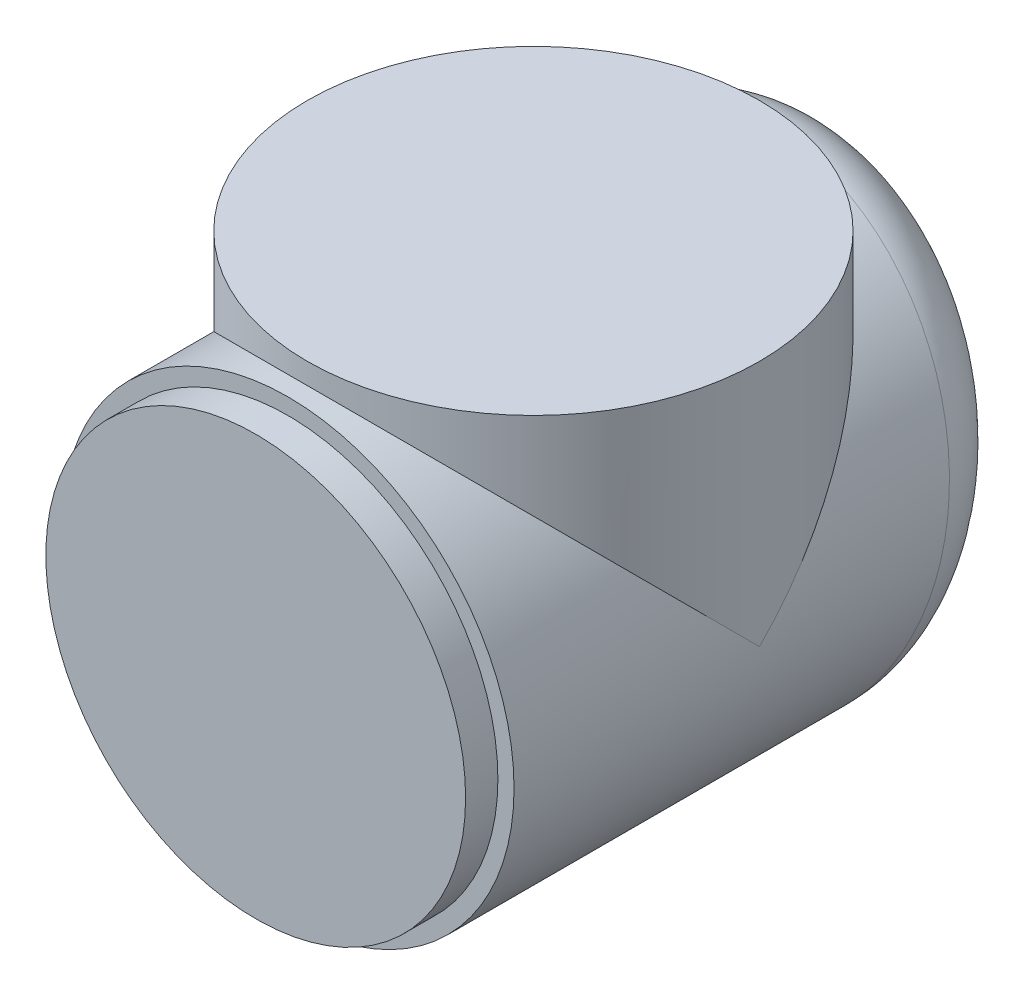
ISO-10303-21;
HEADER;
FILE_DESCRIPTION(('STEP AP214'),'2;1');
FILE_NAME('part.step','',(''),(''),'','','');
FILE_SCHEMA(('AUTOMOTIVE_DESIGN { 1 0 10303 214 1 1 1 1 }'));
ENDSEC;
DATA;
#1=APPLICATION_CONTEXT('core data for automotive mechanical design processes');
#2=APPLICATION_PROTOCOL_DEFINITION('international standard','automotive_design',2000,#1);
#3=PRODUCT_CONTEXT('',#1,'mechanical');
#4=PRODUCT('Part','Part','',(#3));
#5=PRODUCT_RELATED_PRODUCT_CATEGORY('part','',(#4));
#6=PRODUCT_DEFINITION_FORMATION('','',#4);
#7=PRODUCT_DEFINITION_CONTEXT('part definition',#1,'design');
#8=PRODUCT_DEFINITION('design','',#6,#7);
#9=PRODUCT_DEFINITION_SHAPE('','',#8);
#10=(LENGTH_UNIT() NAMED_UNIT(*) SI_UNIT(.MILLI.,.METRE.));
#11=(NAMED_UNIT(*) PLANE_ANGLE_UNIT() SI_UNIT($,.RADIAN.));
#12=(NAMED_UNIT(*) SI_UNIT($,.STERADIAN.) SOLID_ANGLE_UNIT());
#13=UNCERTAINTY_MEASURE_WITH_UNIT(LENGTH_MEASURE(1.E-05),#10,'distance_accuracy_value','');
#14=(GEOMETRIC_REPRESENTATION_CONTEXT(3) GLOBAL_UNCERTAINTY_ASSIGNED_CONTEXT((#13)) GLOBAL_UNIT_ASSIGNED_CONTEXT((#10,
#11,#12)) REPRESENTATION_CONTEXT('',''));
#15=CARTESIAN_POINT('',(0.,0.,0.));
#16=DIRECTION('',(0.,0.,1.));
#17=DIRECTION('',(1.,0.,0.));
#18=AXIS2_PLACEMENT_3D('',#15,#16,#17);
#19=CARTESIAN_POINT('',(0.,0.,-49.1));
#20=DIRECTION('',(0.,0.,1.));
#21=DIRECTION('',(1.,0.,0.));
#22=AXIS2_PLACEMENT_3D('',#19,#20,#21);
#23=CYLINDRICAL_SURFACE('',#22,35.);
#24=CARTESIAN_POINT('',(0.,0.,0.));
#25=DIRECTION('',(0.,0.707106781186547,0.707106781186547));
#26=DIRECTION('',(0.,-0.707106781186547,0.707106781186547));
#27=AXIS2_PLACEMENT_3D('',#24,#25,#26);
#28=ELLIPSE('',#27,49.4974746830583,35.);
#29=CARTESIAN_POINT('',(-35.,0.,0.));
#30=VERTEX_POINT('',#29);
#31=CARTESIAN_POINT('',(35.,0.,0.));
#32=VERTEX_POINT('',#31);
#33=EDGE_CURVE('E44',#30,#32,#28,.F.);
#34=ORIENTED_EDGE('',*,*,#33,.T.);
#35=CARTESIAN_POINT('',(0.,0.,0.));
#36=DIRECTION('',(0.,-0.707106781186547,0.707106781186547));
#37=DIRECTION('',(0.,0.707106781186547,0.707106781186547));
#38=AXIS2_PLACEMENT_3D('',#35,#36,#37);
#39=ELLIPSE('',#38,49.4974746830583,35.);
#40=EDGE_CURVE('E11',#32,#30,#39,.T.);
#41=ORIENTED_EDGE('',*,*,#40,.T.);
#42=EDGE_LOOP('',(#34,#41));
#43=FACE_BOUND('',#42,.T.);
#44=CARTESIAN_POINT('',(0.,0.,-28.6998430153135));
#45=DIRECTION('',(0.,-0.199960011996001,-0.979804058780407));
#46=DIRECTION('',(0.,-0.979804058780407,0.199960011996001));
#47=AXIS2_PLACEMENT_3D('',#44,#45,#46);
#48=ELLIPSE('',#47,35.7214278572857,35.);
#49=CARTESIAN_POINT('',(0.,-35.,-21.5569858724564));
#50=VERTEX_POINT('',#49);
#51=EDGE_CURVE('E53',#50,#50,#48,.F.);
#52=ORIENTED_EDGE('',*,*,#51,.T.);
#53=EDGE_LOOP('',(#52));
#54=FACE_BOUND('',#53,.T.);
#55=CARTESIAN_POINT('',(0.,0.,38.));
#56=DIRECTION('',(0.,0.,1.));
#57=DIRECTION('',(1.,0.,0.));
#58=AXIS2_PLACEMENT_3D('',#55,#56,#57);
#59=CIRCLE('',#58,35.);
#60=CARTESIAN_POINT('',(35.,0.,38.));
#61=VERTEX_POINT('',#60);
#62=EDGE_CURVE('E62',#61,#61,#59,.T.);
#63=ORIENTED_EDGE('',*,*,#62,.F.);
#64=EDGE_LOOP('',(#63));
#65=FACE_BOUND('',#64,.T.);
#66=ADVANCED_FACE('F34',(#43,#54,#65),#23,.T.);
#67=CARTESIAN_POINT('',(-35.,-35.,-29.1));
#68=DIRECTION('',(0.,0.274721127897378,0.961523947640823));
#69=DIRECTION('',(0.,-0.961523947640823,0.274721127897378));
#70=AXIS2_PLACEMENT_3D('',#67,#68,#69);
#71=PLANE('',#70);
#72=CARTESIAN_POINT('',(0.,-2.74721127897378,-38.3150824917218));
#73=DIRECTION('',(0.,0.274721127897378,0.961523947640823));
#74=DIRECTION('',(0.,-0.961523947640823,0.274721127897378));
#75=AXIS2_PLACEMENT_3D('',#72,#73,#74);
#76=ELLIPSE('',#75,26.0003924617161,25.);
#77=CARTESIAN_POINT('',(0.,-27.7472112789738,-31.1722253488646));
#78=VERTEX_POINT('',#77);
#79=EDGE_CURVE('E68',#78,#78,#76,.F.);
#80=ORIENTED_EDGE('',*,*,#79,.T.);
#81=EDGE_LOOP('',(#80));
#82=FACE_BOUND('',#81,.T.);
#83=ADVANCED_FACE('F56',(#82),#71,.F.);
#84=CARTESIAN_POINT('',(0.,-27.7472112789738,-31.1722253488646));
#85=CARTESIAN_POINT('',(0.,-35.,-29.1));
#86=CARTESIAN_POINT('',(0.,-35.,-21.5569858724564));
#87=CARTESIAN_POINT('',(1.09108091283731,-27.7472112789738,-31.1722253488646));
#88=CARTESIAN_POINT('',(1.43345338118228,-35.,-29.1));
#89=CARTESIAN_POINT('',(1.52751327797223,-35.,-21.5569858724564));
#90=CARTESIAN_POINT('',(2.18216182567463,-27.6756476021358,-31.1926721136755));
#91=CARTESIAN_POINT('',(2.86779095380467,-34.9120710459134,-29.1251225583105));
#92=CARTESIAN_POINT('',(3.05502655594448,-34.8998108524268,-21.5774326372673));
#93=CARTESIAN_POINT('',(4.34563680370093,-27.3908219923918,-31.2740508593166));
#94=CARTESIAN_POINT('',(5.7139282748752,-34.5621837627229,-29.2250903535077));
#95=CARTESIAN_POINT('',(6.08389152518131,-34.5010549987852,-21.6588113829084));
#96=CARTESIAN_POINT('',(5.41800305841691,-27.1773650124044,-31.3350385678845));
#97=CARTESIAN_POINT('',(7.12741061631932,-34.299556418007,-29.3001267377123));
#98=CARTESIAN_POINT('',(7.58520428178367,-34.2022152268028,-21.7197990914762));
#99=CARTESIAN_POINT('',(7.52574038951876,-26.6126009654066,-31.4963997241696));
#100=CARTESIAN_POINT('',(9.91147793625199,-33.6043492969241,-29.498757343736));
#101=CARTESIAN_POINT('',(10.5360365453263,-33.4115455610059,-21.8811602477613));
#102=CARTESIAN_POINT('',(8.5610058112401,-26.260929816784,-31.5968771952046));
#103=CARTESIAN_POINT('',(11.2834976821545,-33.1704847082132,-29.6227186547962));
#104=CARTESIAN_POINT('',(11.9854081357361,-32.9192059529343,-21.9816377187963));
#105=CARTESIAN_POINT('',(10.5769171990641,-25.4259154958068,-31.8354527154838));
#106=CARTESIAN_POINT('',(13.964902297941,-32.13903197755,-29.9174194349857));
#107=CARTESIAN_POINT('',(14.8076840786898,-31.7501859035662,-22.2202132390755));
#108=CARTESIAN_POINT('',(11.5573451107606,-24.9420862445672,-31.9736896444094));
#109=CARTESIAN_POINT('',(15.2753388623893,-31.5396423058252,-30.0886736269071));
#110=CARTESIAN_POINT('',(16.1802831550649,-31.0728249518308,-22.3584501680011));
#111=CARTESIAN_POINT('',(13.4469261071108,-23.8511405237061,-32.2853884217983));
#112=CARTESIAN_POINT('',(17.814644728026,-30.1854079954532,-30.4755977155848));
#113=CARTESIAN_POINT('',(18.8256965499551,-29.5455009426253,-22.67014894539));
#114=CARTESIAN_POINT('',(14.3557361132463,-23.2434753665676,-32.4590070381235));
#115=CARTESIAN_POINT('',(19.0440864861379,-29.4283771564413,-30.6918922410168));
#116=CARTESIAN_POINT('',(20.0980305585448,-28.6947697226314,-22.8437675617153));
#117=CARTESIAN_POINT('',(16.0866579251947,-21.9152973800787,-32.8384864628347));
#118=CARTESIAN_POINT('',(21.4034304353771,-27.769050289356,-31.1659856316126));
#119=CARTESIAN_POINT('',(22.5213210952725,-26.8353205415468,-23.2232469864264));
#120=CARTESIAN_POINT('',(16.9083128440085,-21.1942347508351,-33.0445043569043));
#121=CARTESIAN_POINT('',(22.5333744855595,-26.8643329539469,-31.4244762988723));
#122=CARTESIAN_POINT('',(23.6716379816119,-25.8258328606059,-23.429264880496));
#123=CARTESIAN_POINT('',(18.4509744322198,-19.6515786636179,-33.4852632389663));
#124=CARTESIAN_POINT('',(24.676840963195,-24.9216272074508,-31.9795350835855));
#125=CARTESIAN_POINT('',(25.8313642051077,-23.6661143385018,-23.8700237625581));
#126=CARTESIAN_POINT('',(19.1714429517694,-18.8294882870842,-33.7201462036902));
#127=CARTESIAN_POINT('',(25.6898673934373,-23.8811345784227,-32.2768186918792));
#128=CARTESIAN_POINT('',(26.8400201324772,-22.5151878113546,-24.104906727282));
#129=CARTESIAN_POINT('',(20.4994744403501,-17.0987697610045,-34.2146372111416));
#130=CARTESIAN_POINT('',(27.5838169087081,-21.6805680482021,-32.905551986228));
#131=CARTESIAN_POINT('',(28.6992642164901,-20.092181874843,-24.5993977347333));
#132=CARTESIAN_POINT('',(21.1064660290273,-16.1897367622214,-34.4743609250796));
#133=CARTESIAN_POINT('',(28.463737419209,-20.5180499172611,-33.2377000236397));
#134=CARTESIAN_POINT('',(29.5490524406382,-18.8195356765467,-24.8591214486714));
#135=CARTESIAN_POINT('',(22.1971755752942,-14.3005783973016,-35.0141204579138));
#136=CARTESIAN_POINT('',(30.0770894474211,-18.0887232943095,-33.931793344483));
#137=CARTESIAN_POINT('',(31.0760458054118,-16.174713965659,-25.3988809815056));
#138=CARTESIAN_POINT('',(22.6803447957253,-13.3201604836859,-35.294239861804));
#139=CARTESIAN_POINT('',(30.8090734661703,-16.819656371565,-34.2943838938385));
#140=CARTESIAN_POINT('',(31.7524827140154,-14.802128886597,-25.6790003853958));
#141=CARTESIAN_POINT('',(23.5151020941965,-11.3048841710705,-35.8700330939798));
#142=CARTESIAN_POINT('',(32.1135517283439,-14.1940494438345,-35.0445573017616));
#143=CARTESIAN_POINT('',(32.9211429318751,-11.9807420489355,-26.2547936175716));
#144=CARTESIAN_POINT('',(23.8662198279514,-10.2698458696208,-36.1657583229655));
#145=CARTESIAN_POINT('',(32.684237045671,-12.8355418642744,-35.432702324493));
#146=CARTESIAN_POINT('',(33.4127077591319,-10.5316884269059,-26.5505188465572));
#147=CARTESIAN_POINT('',(24.4307703921956,-8.16292059947017,-36.76773697158));
#148=CARTESIAN_POINT('',(33.6545942821809,-10.0493479846885,-36.2287577186604));
#149=CARTESIAN_POINT('',(34.2030785490738,-7.58199304869495,-27.1524974951717));
#150=CARTESIAN_POINT('',(24.6438597383181,-7.09094864238911,-37.0740146736031));
#151=CARTESIAN_POINT('',(34.0521939881995,-8.62006881925728,-36.6371231944979));
#152=CARTESIAN_POINT('',(34.5014036336453,-6.08123230878147,-27.4587751971949));
#153=CARTESIAN_POINT('',(24.9285650945313,-4.92840289461881,-37.6918848872518));
#154=CARTESIAN_POINT('',(34.6664445268543,-5.71208354457657,-37.467976130121));
#155=CARTESIAN_POINT('',(34.8999911323438,-3.05366826190303,-28.0766454108435));
#156=CARTESIAN_POINT('',(25.,-3.8378070867963,-38.0034836894868));
#157=CARTESIAN_POINT('',(34.8808676930596,-4.23222329855906,-37.8907933432688));
#158=CARTESIAN_POINT('',(35.,-1.52683413095152,-28.3882442130785));
#159=CARTESIAN_POINT('',(25.,-1.65661547115127,-38.6266812939568));
#160=CARTESIAN_POINT('',(35.1205686427329,-1.24429499839684,-38.7444871433152));
#161=CARTESIAN_POINT('',(35.,1.52683413095151,-29.0114418175485));
#162=CARTESIAN_POINT('',(24.9285650945313,-0.56601966332876,-38.9382800961918));
#163=CARTESIAN_POINT('',(35.1435782738045,0.264442596963204,-39.1755550277038));
#164=CARTESIAN_POINT('',(34.8999911323438,3.05366826190303,-29.3230406197835));
#165=CARTESIAN_POINT('',(24.6438597383181,1.59652608444155,-39.5561503098404));
#166=CARTESIAN_POINT('',(34.9942122083426,3.28740784928805,-40.0392593855109));
#167=CARTESIAN_POINT('',(34.5014036336453,6.08123230878146,-29.9409108334322));
#168=CARTESIAN_POINT('',(24.4307703921956,2.66849804152261,-39.8624280118636));
#169=CARTESIAN_POINT('',(34.8196492389227,4.80179209448718,-40.4719405984249));
#170=CARTESIAN_POINT('',(34.2030785490738,7.58199304869495,-30.2471885354554));
#171=CARTESIAN_POINT('',(23.8662198279514,4.77542331167326,-40.4644066604781));
#172=CARTESIAN_POINT('',(34.2711691464028,7.81180347985214,-41.3319438513863));
#173=CARTESIAN_POINT('',(33.4127077591319,10.5316884269059,-30.8491671840698));
#174=CARTESIAN_POINT('',(23.5151020941965,5.81046161312297,-40.7601318894637));
#175=CARTESIAN_POINT('',(33.8952733437755,9.30706477504779,-41.7591613642994));
#176=CARTESIAN_POINT('',(32.9211429318751,11.9807420489355,-31.1448924130555));
#177=CARTESIAN_POINT('',(22.6803447957253,7.82573792573832,-41.3359251216395));
#178=CARTESIAN_POINT('',(32.9428685539385,12.2530635758136,-42.6008753073753));
#179=CARTESIAN_POINT('',(31.7524827140154,14.8021288865969,-31.7206856452313));
#180=CARTESIAN_POINT('',(22.1971755752942,8.80615583935407,-41.6160445255297));
#181=CARTESIAN_POINT('',(32.3647226134196,13.7029259797655,-43.0151217085044));
#182=CARTESIAN_POINT('',(31.0760458054119,16.174713965659,-32.0008050491215));
#183=CARTESIAN_POINT('',(21.1064660290273,10.6953142042738,-42.1558040583639));
#184=CARTESIAN_POINT('',(31.0098445076532,16.5309530954485,-43.8231294558424));
#185=CARTESIAN_POINT('',(29.5490524406382,18.8195356765467,-32.5405645819557));
#186=CARTESIAN_POINT('',(20.4994744403501,11.6043472030569,-42.415527772302));
#187=CARTESIAN_POINT('',(30.2319520886626,17.907775095461,-44.2165071701317));
#188=CARTESIAN_POINT('',(28.6992642164901,20.092181874843,-32.8002882958937));
#189=CARTESIAN_POINT('',(19.1714429517694,13.3350657291366,-42.9100187797533));
#190=CARTESIAN_POINT('',(28.4835923577729,20.5614355524542,-44.9746958721298));
#191=CARTESIAN_POINT('',(26.8400201324772,22.5151878113546,-33.2947793033451));
#192=CARTESIAN_POINT('',(18.4509744322198,14.1571561056704,-43.1449017444772));
#193=CARTESIAN_POINT('',(27.512570472187,21.8365403070051,-45.3390115162872));
#194=CARTESIAN_POINT('',(25.8313642051077,23.6661143385018,-33.529662268069));
#195=CARTESIAN_POINT('',(16.9083128440085,15.6998121928876,-43.5856606265393));
#196=CARTESIAN_POINT('',(25.3887076598691,24.2579343636668,-46.0308383896191));
#197=CARTESIAN_POINT('',(23.6716379816119,25.8258328606059,-33.9704211501311));
#198=CARTESIAN_POINT('',(16.0866579251947,16.4208748221311,-43.7916785206089));
#199=CARTESIAN_POINT('',(24.2360278637739,25.402215398627,-46.3577758281791));
#200=CARTESIAN_POINT('',(22.5213210952725,26.8353205415468,-34.1764390442006));
#201=CARTESIAN_POINT('',(14.3557361132463,17.74905280862,-44.17115794532));
#202=CARTESIAN_POINT('',(21.7650546439561,27.5334915626623,-46.9667118750464));
#203=CARTESIAN_POINT('',(20.0980305585448,28.6947697226314,-34.5559184689118));
#204=CARTESIAN_POINT('',(13.4469261071108,18.3567179657586,-44.3447765616453));
#205=CARTESIAN_POINT('',(20.4477115945124,28.5183601608445,-47.2481029030984));
#206=CARTESIAN_POINT('',(18.8256965499551,29.5455009426253,-34.7295370852371));
#207=CARTESIAN_POINT('',(11.5573451107606,19.4476636866196,-44.6564753390342));
#208=CARTESIAN_POINT('',(17.6695466176983,30.3039719823389,-47.7582777092397));
#209=CARTESIAN_POINT('',(16.1802831550649,31.0728249518308,-35.0412358626259));
#210=CARTESIAN_POINT('',(10.5769171990641,19.9314929378592,-44.7947122679598));
#211=CARTESIAN_POINT('',(16.2104818820974,31.1026588366051,-47.9864739533157));
#212=CARTESIAN_POINT('',(14.8076840786898,31.7501859035662,-35.1794727915515));
#213=CARTESIAN_POINT('',(8.5610058112401,20.7665072588364,-45.033287788239));
#214=CARTESIAN_POINT('',(13.176995641447,32.4922649145575,-48.3835042613021));
#215=CARTESIAN_POINT('',(11.9854081357361,32.9192059529343,-35.4180483118307));
#216=CARTESIAN_POINT('',(7.52574038951877,21.118178407459,-45.133765259274));
#217=CARTESIAN_POINT('',(11.6050830561026,33.0814011809216,-48.5518289088348));
#218=CARTESIAN_POINT('',(10.5360365453263,33.4115455610059,-35.5185257828658));
#219=CARTESIAN_POINT('',(5.41800305841692,21.6829424544568,-45.2951264155591));
#220=CARTESIAN_POINT('',(8.3794769789984,34.0331536104975,-48.8237581744279));
#221=CARTESIAN_POINT('',(7.58520428178369,34.2022152268028,-35.6798869391509));
#222=CARTESIAN_POINT('',(4.34563680370094,21.8963994344442,-45.3561141241269));
#223=CARTESIAN_POINT('',(6.72890839959668,34.3944524464718,-48.9269864132776));
#224=CARTESIAN_POINT('',(6.08389152518132,34.5010549987852,-35.7408746477187));
#225=CARTESIAN_POINT('',(2.18216182567463,22.1812250441882,-45.4374928697681));
#226=CARTESIAN_POINT('',(3.38381829585065,34.8782258618346,-49.0652073890956));
#227=CARTESIAN_POINT('',(3.05502655594449,34.8998108524268,-35.8222533933598));
#228=CARTESIAN_POINT('',(1.09108091283732,22.2527887210262,-45.4579396345789));
#229=CARTESIAN_POINT('',(1.69282714246745,35.,-49.1));
#230=CARTESIAN_POINT('',(1.52751327797224,35.,-35.8427001581707));
#231=CARTESIAN_POINT('',(-1.09108091283731,22.2527887210262,-45.4579396345789));
#232=CARTESIAN_POINT('',(-1.69282714246744,35.,-49.1));
#233=CARTESIAN_POINT('',(-1.52751327797224,35.,-35.8427001581707));
#234=CARTESIAN_POINT('',(-2.18216182567463,22.1812250441882,-45.4374928697681));
#235=CARTESIAN_POINT('',(-3.38381829585064,34.8782258618346,-49.0652073890956));
#236=CARTESIAN_POINT('',(-3.05502655594448,34.8998108524268,-35.8222533933598));
#237=CARTESIAN_POINT('',(-4.34563680370094,21.8963994344442,-45.3561141241269));
#238=CARTESIAN_POINT('',(-6.72890839959667,34.3944524464718,-48.9269864132776));
#239=CARTESIAN_POINT('',(-6.08389152518131,34.5010549987852,-35.7408746477187));
#240=CARTESIAN_POINT('',(-5.41800305841691,21.6829424544568,-45.2951264155591));
#241=CARTESIAN_POINT('',(-8.37947697899839,34.0331536104975,-48.8237581744279));
#242=CARTESIAN_POINT('',(-7.58520428178368,34.2022152268028,-35.6798869391509));
#243=CARTESIAN_POINT('',(-7.52574038951876,21.118178407459,-45.133765259274));
#244=CARTESIAN_POINT('',(-11.6050830561026,33.0814011809216,-48.5518289088348));
#245=CARTESIAN_POINT('',(-10.5360365453263,33.4115455610059,-35.5185257828658));
#246=CARTESIAN_POINT('',(-8.5610058112401,20.7665072588364,-45.033287788239));
#247=CARTESIAN_POINT('',(-13.176995641447,32.4922649145575,-48.3835042613022));
#248=CARTESIAN_POINT('',(-11.9854081357361,32.9192059529343,-35.4180483118308));
#249=CARTESIAN_POINT('',(-10.5769171990641,19.9314929378592,-44.7947122679598));
#250=CARTESIAN_POINT('',(-16.2104818820974,31.1026588366051,-47.9864739533158));
#251=CARTESIAN_POINT('',(-14.8076840786898,31.7501859035662,-35.1794727915515));
#252=CARTESIAN_POINT('',(-11.5573451107606,19.4476636866196,-44.6564753390342));
#253=CARTESIAN_POINT('',(-17.6695466176983,30.3039719823389,-47.7582777092397));
#254=CARTESIAN_POINT('',(-16.1802831550649,31.0728249518308,-35.0412358626259));
#255=CARTESIAN_POINT('',(-13.4469261071108,18.3567179657586,-44.3447765616453));
#256=CARTESIAN_POINT('',(-20.4477115945123,28.5183601608445,-47.2481029030984));
#257=CARTESIAN_POINT('',(-18.8256965499551,29.5455009426253,-34.7295370852371));
#258=CARTESIAN_POINT('',(-14.3557361132463,17.7490528086201,-44.17115794532));
#259=CARTESIAN_POINT('',(-21.7650546439561,27.5334915626623,-46.9667118750464));
#260=CARTESIAN_POINT('',(-20.0980305585448,28.6947697226314,-34.5559184689118));
#261=CARTESIAN_POINT('',(-16.0866579251947,16.4208748221311,-43.7916785206089));
#262=CARTESIAN_POINT('',(-24.2360278637738,25.402215398627,-46.3577758281791));
#263=CARTESIAN_POINT('',(-22.5213210952725,26.8353205415468,-34.1764390442006));
#264=CARTESIAN_POINT('',(-16.9083128440085,15.6998121928876,-43.5856606265393));
#265=CARTESIAN_POINT('',(-25.3887076598691,24.2579343636668,-46.0308383896191));
#266=CARTESIAN_POINT('',(-23.6716379816119,25.8258328606059,-33.9704211501311));
#267=CARTESIAN_POINT('',(-18.4509744322198,14.1571561056704,-43.1449017444772));
#268=CARTESIAN_POINT('',(-27.512570472187,21.8365403070051,-45.3390115162872));
#269=CARTESIAN_POINT('',(-25.8313642051077,23.6661143385018,-33.529662268069));
#270=CARTESIAN_POINT('',(-19.1714429517694,13.3350657291366,-42.9100187797533));
#271=CARTESIAN_POINT('',(-28.4835923577729,20.5614355524542,-44.9746958721298));
#272=CARTESIAN_POINT('',(-26.8400201324772,22.5151878113546,-33.2947793033451));
#273=CARTESIAN_POINT('',(-20.4994744403501,11.604347203057,-42.415527772302));
#274=CARTESIAN_POINT('',(-30.2319520886626,17.907775095461,-44.2165071701317));
#275=CARTESIAN_POINT('',(-28.6992642164901,20.092181874843,-32.8002882958938));
#276=CARTESIAN_POINT('',(-21.1064660290273,10.6953142042738,-42.155804058364));
#277=CARTESIAN_POINT('',(-31.0098445076532,16.5309530954486,-43.8231294558424));
#278=CARTESIAN_POINT('',(-29.5490524406382,18.8195356765467,-32.5405645819557));
#279=CARTESIAN_POINT('',(-22.1971755752942,8.80615583935408,-41.6160445255297));
#280=CARTESIAN_POINT('',(-32.3647226134196,13.7029259797655,-43.0151217085044));
#281=CARTESIAN_POINT('',(-31.0760458054118,16.174713965659,-32.0008050491215));
#282=CARTESIAN_POINT('',(-22.6803447957253,7.82573792573833,-41.3359251216395));
#283=CARTESIAN_POINT('',(-32.9428685539385,12.2530635758136,-42.6008753073753));
#284=CARTESIAN_POINT('',(-31.7524827140154,14.802128886597,-31.7206856452313));
#285=CARTESIAN_POINT('',(-23.5151020941965,5.81046161312297,-40.7601318894637));
#286=CARTESIAN_POINT('',(-33.8952733437755,9.30706477504778,-41.7591613642994));
#287=CARTESIAN_POINT('',(-32.9211429318751,11.9807420489355,-31.1448924130555));
#288=CARTESIAN_POINT('',(-23.8662198279514,4.77542331167326,-40.4644066604781));
#289=CARTESIAN_POINT('',(-34.2711691464028,7.81180347985214,-41.3319438513863));
#290=CARTESIAN_POINT('',(-33.4127077591319,10.5316884269059,-30.8491671840698));
#291=CARTESIAN_POINT('',(-24.4307703921956,2.66849804152261,-39.8624280118636));
#292=CARTESIAN_POINT('',(-34.8196492389227,4.80179209448718,-40.4719405984249));
#293=CARTESIAN_POINT('',(-34.2030785490738,7.58199304869495,-30.2471885354554));
#294=CARTESIAN_POINT('',(-24.6438597383181,1.59652608444155,-39.5561503098404));
#295=CARTESIAN_POINT('',(-34.9942122083426,3.28740784928805,-40.0392593855109));
#296=CARTESIAN_POINT('',(-34.5014036336453,6.08123230878147,-29.9409108334322));
#297=CARTESIAN_POINT('',(-24.9285650945313,-0.566019663328755,-38.9382800961918));
#298=CARTESIAN_POINT('',(-35.1435782738045,0.264442596963209,-39.1755550277038));
#299=CARTESIAN_POINT('',(-34.8999911323438,3.05366826190304,-29.3230406197836));
#300=CARTESIAN_POINT('',(-25.,-1.65661547115127,-38.6266812939568));
#301=CARTESIAN_POINT('',(-35.1205686427329,-1.24429499839683,-38.7444871433152));
#302=CARTESIAN_POINT('',(-35.,1.52683413095152,-29.0114418175485));
#303=CARTESIAN_POINT('',(-25.,-3.83780708679629,-38.0034836894868));
#304=CARTESIAN_POINT('',(-34.8808676930596,-4.23222329855905,-37.8907933432688));
#305=CARTESIAN_POINT('',(-35.,-1.52683413095151,-28.3882442130785));
#306=CARTESIAN_POINT('',(-24.9285650945313,-4.9284028946188,-37.6918848872518));
#307=CARTESIAN_POINT('',(-34.6664445268543,-5.71208354457656,-37.467976130121));
#308=CARTESIAN_POINT('',(-34.8999911323438,-3.05366826190302,-28.0766454108435));
#309=CARTESIAN_POINT('',(-24.6438597383181,-7.09094864238911,-37.0740146736031));
#310=CARTESIAN_POINT('',(-34.0521939881995,-8.62006881925726,-36.6371231944979));
#311=CARTESIAN_POINT('',(-34.5014036336453,-6.08123230878145,-27.4587751971949));
#312=CARTESIAN_POINT('',(-24.4307703921956,-8.16292059947017,-36.76773697158));
#313=CARTESIAN_POINT('',(-33.6545942821809,-10.0493479846885,-36.2287577186604));
#314=CARTESIAN_POINT('',(-34.2030785490738,-7.58199304869494,-27.1524974951717));
#315=CARTESIAN_POINT('',(-23.8662198279514,-10.2698458696208,-36.1657583229655));
#316=CARTESIAN_POINT('',(-32.684237045671,-12.8355418642744,-35.432702324493));
#317=CARTESIAN_POINT('',(-33.4127077591319,-10.5316884269058,-26.5505188465572));
#318=CARTESIAN_POINT('',(-23.5151020941965,-11.3048841710705,-35.8700330939799));
#319=CARTESIAN_POINT('',(-32.1135517283439,-14.1940494438344,-35.0445573017616));
#320=CARTESIAN_POINT('',(-32.9211429318751,-11.9807420489354,-26.2547936175716));
#321=CARTESIAN_POINT('',(-22.6803447957253,-13.3201604836859,-35.294239861804));
#322=CARTESIAN_POINT('',(-30.8090734661703,-16.819656371565,-34.2943838938386));
#323=CARTESIAN_POINT('',(-31.7524827140154,-14.8021288865969,-25.6790003853958));
#324=CARTESIAN_POINT('',(-22.1971755752942,-14.3005783973016,-35.0141204579138));
#325=CARTESIAN_POINT('',(-30.0770894474211,-18.0887232943095,-33.931793344483));
#326=CARTESIAN_POINT('',(-31.0760458054119,-16.174713965659,-25.3988809815056));
#327=CARTESIAN_POINT('',(-21.1064660290273,-16.1897367622214,-34.4743609250796));
#328=CARTESIAN_POINT('',(-28.463737419209,-20.5180499172611,-33.2377000236397));
#329=CARTESIAN_POINT('',(-29.5490524406382,-18.8195356765467,-24.8591214486714));
#330=CARTESIAN_POINT('',(-20.4994744403501,-17.0987697610045,-34.2146372111416));
#331=CARTESIAN_POINT('',(-27.5838169087081,-21.6805680482021,-32.905551986228));
#332=CARTESIAN_POINT('',(-28.6992642164902,-20.092181874843,-24.5993977347333));
#333=CARTESIAN_POINT('',(-19.1714429517694,-18.8294882870842,-33.7201462036902));
#334=CARTESIAN_POINT('',(-25.6898673934373,-23.8811345784227,-32.2768186918792));
#335=CARTESIAN_POINT('',(-26.8400201324772,-22.5151878113546,-24.104906727282));
#336=CARTESIAN_POINT('',(-18.4509744322198,-19.6515786636179,-33.4852632389663));
#337=CARTESIAN_POINT('',(-24.676840963195,-24.9216272074508,-31.9795350835855));
#338=CARTESIAN_POINT('',(-25.8313642051077,-23.6661143385018,-23.8700237625581));
#339=CARTESIAN_POINT('',(-16.9083128440085,-21.1942347508351,-33.0445043569043));
#340=CARTESIAN_POINT('',(-22.5333744855595,-26.8643329539469,-31.4244762988723));
#341=CARTESIAN_POINT('',(-23.6716379816119,-25.8258328606059,-23.429264880496));
#342=CARTESIAN_POINT('',(-16.0866579251947,-21.9152973800786,-32.8384864628347));
#343=CARTESIAN_POINT('',(-21.4034304353771,-27.769050289356,-31.1659856316126));
#344=CARTESIAN_POINT('',(-22.5213210952725,-26.8353205415468,-23.2232469864264));
#345=CARTESIAN_POINT('',(-14.3557361132463,-23.2434753665676,-32.4590070381235));
#346=CARTESIAN_POINT('',(-19.0440864861379,-29.4283771564413,-30.6918922410168));
#347=CARTESIAN_POINT('',(-20.0980305585448,-28.6947697226314,-22.8437675617153));
#348=CARTESIAN_POINT('',(-13.4469261071108,-23.8511405237061,-32.2853884217983));
#349=CARTESIAN_POINT('',(-17.814644728026,-30.1854079954532,-30.4755977155848));
#350=CARTESIAN_POINT('',(-18.8256965499551,-29.5455009426253,-22.67014894539));
#351=CARTESIAN_POINT('',(-11.5573451107606,-24.9420862445672,-31.9736896444094));
#352=CARTESIAN_POINT('',(-15.2753388623893,-31.5396423058252,-30.0886736269071));
#353=CARTESIAN_POINT('',(-16.1802831550649,-31.0728249518308,-22.3584501680011));
#354=CARTESIAN_POINT('',(-10.5769171990641,-25.4259154958068,-31.8354527154838));
#355=CARTESIAN_POINT('',(-13.964902297941,-32.13903197755,-29.9174194349857));
#356=CARTESIAN_POINT('',(-14.8076840786898,-31.7501859035662,-22.2202132390755));
#357=CARTESIAN_POINT('',(-8.56100581124011,-26.260929816784,-31.5968771952046));
#358=CARTESIAN_POINT('',(-11.2834976821546,-33.1704847082132,-29.6227186547962));
#359=CARTESIAN_POINT('',(-11.9854081357362,-32.9192059529343,-21.9816377187963));
#360=CARTESIAN_POINT('',(-7.52574038951878,-26.6126009654066,-31.4963997241696));
#361=CARTESIAN_POINT('',(-9.91147793625202,-33.6043492969241,-29.498757343736));
#362=CARTESIAN_POINT('',(-10.5360365453263,-33.4115455610059,-21.8811602477613));
#363=CARTESIAN_POINT('',(-5.41800305841693,-27.1773650124044,-31.3350385678845));
#364=CARTESIAN_POINT('',(-7.12741061631935,-34.299556418007,-29.3001267377123));
#365=CARTESIAN_POINT('',(-7.5852042817837,-34.2022152268028,-21.7197990914762));
#366=CARTESIAN_POINT('',(-4.34563680370094,-27.3908219923918,-31.2740508593166));
#367=CARTESIAN_POINT('',(-5.71392827487521,-34.5621837627229,-29.2250903535077));
#368=CARTESIAN_POINT('',(-6.08389152518131,-34.5010549987852,-21.6588113829084));
#369=CARTESIAN_POINT('',(-2.18216182567462,-27.6756476021358,-31.1926721136755));
#370=CARTESIAN_POINT('',(-2.86779095380466,-34.9120710459134,-29.1251225583105));
#371=CARTESIAN_POINT('',(-3.05502655594447,-34.8998108524268,-21.5774326372673));
#372=CARTESIAN_POINT('',(-1.09108091283731,-27.7472112789738,-31.1722253488646));
#373=CARTESIAN_POINT('',(-1.43345338118229,-35.,-29.1));
#374=CARTESIAN_POINT('',(-1.52751327797224,-35.,-21.5569858724564));
#375=CARTESIAN_POINT('',(0.,-27.7472112789738,-31.1722253488646));
#376=CARTESIAN_POINT('',(0.,-35.,-29.1));
#377=CARTESIAN_POINT('',(0.,-35.,-21.5569858724564));
#378=(BOUNDED_SURFACE() B_SPLINE_SURFACE(3,2,((#84,#85,#86),(#87,#88,#89),(#90,#91,#92),(#93,
#94,#95),(#96,#97,#98),(#99,#100,#101),(#102,#103,#104),(#105,#106,#107),(#108,#109,#110),(#111,
#112,#113),(#114,#115,#116),(#117,#118,#119),(#120,#121,#122),(#123,#124,#125),(#126,#127,#128),
(#129,#130,#131),(#132,#133,#134),(#135,#136,#137),(#138,#139,#140),(#141,#142,#143),(#144,#145,
#146),(#147,#148,#149),(#150,#151,#152),(#153,#154,#155),(#156,#157,#158),(#159,#160,#161),
(#162,#163,#164),(#165,#166,#167),(#168,#169,#170),(#171,#172,#173),(#174,#175,#176),(#177,#178,
#179),(#180,#181,#182),(#183,#184,#185),(#186,#187,#188),(#189,#190,#191),(#192,#193,#194),
(#195,#196,#197),(#198,#199,#200),(#201,#202,#203),(#204,#205,#206),(#207,#208,#209),(#210,#211,
#212),(#213,#214,#215),(#216,#217,#218),(#219,#220,#221),(#222,#223,#224),(#225,#226,#227),
(#228,#229,#230),(#231,#232,#233),(#234,#235,#236),(#237,#238,#239),(#240,#241,#242),(#243,#244,
#245),(#246,#247,#248),(#249,#250,#251),(#252,#253,#254),(#255,#256,#257),(#258,#259,#260),
(#261,#262,#263),(#264,#265,#266),(#267,#268,#269),(#270,#271,#272),(#273,#274,#275),(#276,#277,
#278),(#279,#280,#281),(#282,#283,#284),(#285,#286,#287),(#288,#289,#290),(#291,#292,#293),
(#294,#295,#296),(#297,#298,#299),(#300,#301,#302),(#303,#304,#305),(#306,#307,#308),(#309,#310,
#311),(#312,#313,#314),(#315,#316,#317),(#318,#319,#320),(#321,#322,#323),(#324,#325,#326),
(#327,#328,#329),(#330,#331,#332),(#333,#334,#335),(#336,#337,#338),(#339,#340,#341),(#342,#343,
#344),(#345,#346,#347),(#348,#349,#350),(#351,#352,#353),(#354,#355,#356),(#357,#358,#359),
(#360,#361,#362),(#363,#364,#365),(#366,#367,#368),(#369,#370,#371),(#372,#373,#374),(#375,#376,
#377)),.UNSPECIFIED.,.T.,.F.,.F.) B_SPLINE_SURFACE_WITH_KNOTS((4,2,2,2,2,2,2,2,2,2,2,2,2,2,2,2,
2,2,2,2,2,2,2,2,2,2,2,2,2,2,2,2,2,2,2,2,2,2,2,2,2,2,2,2,2,2,2,2,4),(3,3),(0.,3.27072736354792,
6.54596000439941,9.82987866873693,13.1260421509769,16.4371407197826,19.7648181388023,
23.1095726723404,26.470740053226,29.8465549464073,33.2342825182012,36.6304084055879,
40.0308734337886,43.4313384619893,46.827464349376,50.2151919211699,53.5910068143512,
56.9521741952368,60.2969287287749,63.6246061477946,66.9357047166003,70.2318681988403,
73.5157868631778,76.7910195040293,80.0617468675772,83.3324742311251,86.6077068719766,
89.8916255363141,93.1877890185541,96.4988875873598,99.8265650063795,103.171319539918,
106.532486920803,109.908301813985,113.296029385778,116.692155273165,120.092620301366,
123.493085329566,126.889211216953,130.276938788747,133.652753681928,137.013921062814,
140.358675596352,143.686353015372,146.997451584177,150.293615066417,153.577533730755,
156.852766371606,160.123493735154),(0.,1.),
.UNSPECIFIED.) GEOMETRIC_REPRESENTATION_ITEM() RATIONAL_B_SPLINE_SURFACE(((1.,0.798348648116028,
1.),(1.,0.798348648116028,1.),(1.,0.798102502894061,1.),(1.,0.797121477291113,1.),(1.,
0.796385924166841,1.),(1.,0.794435324878958,1.),(1.,0.79321901225756,1.),(1.,0.790321760558056,
1.),(1.,0.78863910592816,1.),(1.,0.78482962690065,1.),(1.,0.782700824492553,1.),(1.,
0.77802509664699,1.),(1.,0.775476131015163,1.),(1.,0.769991745998724,1.),(1.,0.767054410523592,
1.),(1.,0.760830632485494,1.),(1.,0.757542547568014,1.),(1.,0.750660354067,1.),(1.,
0.747064974317737,1.),(1.,0.739617050636221,1.),(1.,0.735763643987138,1.),(1.,0.727854290230189,
1.),(1.,0.723797864697885,1.),(1.,0.715542760017812,1.),(1.,0.711343905738249,1.),(1.,
0.702869656634847,1.),(1.,0.698594261811008,1.),(1.,0.690037642653338,1.),(1.,0.685756432719781,
1.),(1.,0.677263208673956,1.),(1.,0.673051049627435,1.),(1.,0.66477425922936,1.),(1.,
0.660709161192501,1.),(1.,0.652806734384329,1.),(1.,0.64896849386392,1.),(1.,0.64160010011772,
1.),(1.,0.638068533997984,1.),(1.,0.631391603787772,1.),(1.,0.628244359947871,1.),(1.,
0.622409308829426,1.),(1.,0.619719290707065,1.),(1.,0.614864099270273,1.),(1.,0.61269661331379,
1.),(1.,0.608941066506795,1.),(1.,0.607350883079368,1.),(1.,0.604790921132821,1.),(1.,
0.603819512756758,1.),(1.,0.602522251843769,1.),(1.,0.602195513144453,1.),(1.,0.602195513144453,
1.),(1.,0.602522251843769,1.),(1.,0.603819512756758,1.),(1.,0.604790921132821,1.),(1.,
0.607350883079368,1.),(1.,0.608941066506795,1.),(1.,0.61269661331379,1.),(1.,0.614864099270273,
1.),(1.,0.619719290707066,1.),(1.,0.622409308829426,1.),(1.,0.628244359947871,1.),(1.,
0.631391603787772,1.),(1.,0.638068533997984,1.),(1.,0.64160010011772,1.),(1.,0.64896849386392,
1.),(1.,0.652806734384329,1.),(1.,0.660709161192501,1.),(1.,0.66477425922936,1.),(1.,
0.673051049627435,1.),(1.,0.677263208673956,1.),(1.,0.685756432719781,1.),(1.,0.690037642653338,
1.),(1.,0.698594261811008,1.),(1.,0.702869656634846,1.),(1.,0.711343905738248,1.),(1.,
0.715542760017812,1.),(1.,0.723797864697885,1.),(1.,0.727854290230189,1.),(1.,0.735763643987138,
1.),(1.,0.739617050636221,1.),(1.,0.747064974317737,1.),(1.,0.750660354067,1.),(1.,
0.757542547568014,1.),(1.,0.760830632485494,1.),(1.,0.767054410523592,1.),(1.,0.769991745998724,
1.),(1.,0.775476131015163,1.),(1.,0.77802509664699,1.),(1.,0.782700824492553,1.),(1.,
0.784829626900649,1.),(1.,0.78863910592816,1.),(1.,0.790321760558056,1.),(1.,0.79321901225756,
1.),(1.,0.794435324878958,1.),(1.,0.796385924166841,1.),(1.,0.797121477291113,1.),(1.,
0.798102502894061,1.),(1.,0.798348648116028,1.),(1.,0.798348648116028,1.))) REPRESENTATION_ITEM('') SURFACE());
#379=CARTESIAN_POINT('',(0.,-25.,-21.5569858724564));
#380=DIRECTION('',(1.,0.,0.));
#381=DIRECTION('',(0.,-1.,0.));
#382=AXIS2_PLACEMENT_3D('',#379,#380,#381);
#383=CIRCLE('',#382,10.);
#384=EDGE_CURVE('',#50,#78,#383,.T.);
#385=ORIENTED_EDGE('',*,*,#51,.F.);
#386=ORIENTED_EDGE('',*,*,#79,.F.);
#387=ORIENTED_EDGE('',*,*,#384,.T.);
#388=ORIENTED_EDGE('',*,*,#384,.F.);
#389=EDGE_LOOP('',(#385,#387,#386,#388));
#390=FACE_BOUND('',#389,.T.);
#391=ADVANCED_FACE('F36',(#390),#378,.T.);
#392=CARTESIAN_POINT('',(0.,38.25,0.));
#393=DIRECTION('',(0.,-1.,0.));
#394=DIRECTION('',(0.,0.,-1.));
#395=AXIS2_PLACEMENT_3D('',#392,#393,#394);
#396=CYLINDRICAL_SURFACE('',#395,35.);
#397=ORIENTED_EDGE('',*,*,#40,.F.);
#398=ORIENTED_EDGE('',*,*,#33,.F.);
#399=EDGE_LOOP('',(#397,#398));
#400=FACE_BOUND('',#399,.T.);
#401=CARTESIAN_POINT('',(0.,38.25,0.));
#402=DIRECTION('',(0.,1.,0.));
#403=DIRECTION('',(0.,0.,1.));
#404=AXIS2_PLACEMENT_3D('',#401,#402,#403);
#405=CIRCLE('',#404,35.);
#406=CARTESIAN_POINT('',(0.,38.25,35.));
#407=VERTEX_POINT('',#406);
#408=EDGE_CURVE('E64',#407,#407,#405,.T.);
#409=ORIENTED_EDGE('',*,*,#408,.F.);
#410=EDGE_LOOP('',(#409));
#411=FACE_BOUND('',#410,.T.);
#412=ADVANCED_FACE('F50',(#400,#411),#396,.T.);
#413=CARTESIAN_POINT('',(0.,38.25,0.));
#414=DIRECTION('',(0.,1.,0.));
#415=DIRECTION('',(0.,0.,1.));
#416=AXIS2_PLACEMENT_3D('',#413,#414,#415);
#417=PLANE('',#416);
#418=ORIENTED_EDGE('',*,*,#408,.T.);
#419=EDGE_LOOP('',(#418));
#420=FACE_BOUND('',#419,.T.);
#421=ADVANCED_FACE('F87',(#420),#417,.T.);
#422=CARTESIAN_POINT('',(0.,0.,38.));
#423=DIRECTION('',(0.,0.,1.));
#424=DIRECTION('',(1.,0.,0.));
#425=AXIS2_PLACEMENT_3D('',#422,#423,#424);
#426=PLANE('',#425);
#427=CARTESIAN_POINT('',(0.,0.,38.));
#428=DIRECTION('',(0.,0.,1.));
#429=DIRECTION('',(1.,0.,0.));
#430=AXIS2_PLACEMENT_3D('',#427,#428,#429);
#431=CIRCLE('',#430,32.5);
#432=CARTESIAN_POINT('',(32.5,0.,38.));
#433=VERTEX_POINT('',#432);
#434=EDGE_CURVE('E65',#433,#433,#431,.T.);
#435=ORIENTED_EDGE('',*,*,#434,.F.);
#436=EDGE_LOOP('',(#435));
#437=FACE_BOUND('',#436,.T.);
#438=ORIENTED_EDGE('',*,*,#62,.T.);
#439=EDGE_LOOP('',(#438));
#440=FACE_BOUND('',#439,.T.);
#441=ADVANCED_FACE('F102',(#437,#440),#426,.T.);
#442=CARTESIAN_POINT('',(0.,0.,38.));
#443=DIRECTION('',(0.,0.,1.));
#444=DIRECTION('',(1.,0.,0.));
#445=AXIS2_PLACEMENT_3D('',#442,#443,#444);
#446=CYLINDRICAL_SURFACE('',#445,32.5);
#447=ORIENTED_EDGE('',*,*,#434,.T.);
#448=EDGE_LOOP('',(#447));
#449=FACE_BOUND('',#448,.T.);
#450=CARTESIAN_POINT('',(0.,0.,43.));
#451=DIRECTION('',(0.,0.,1.));
#452=DIRECTION('',(1.,0.,0.));
#453=AXIS2_PLACEMENT_3D('',#450,#451,#452);
#454=CIRCLE('',#453,32.5);
#455=CARTESIAN_POINT('',(32.5,0.,43.));
#456=VERTEX_POINT('',#455);
#457=EDGE_CURVE('E71',#456,#456,#454,.T.);
#458=ORIENTED_EDGE('',*,*,#457,.F.);
#459=EDGE_LOOP('',(#458));
#460=FACE_BOUND('',#459,.T.);
#461=ADVANCED_FACE('F96',(#449,#460),#446,.T.);
#462=CARTESIAN_POINT('',(0.,0.,43.));
#463=DIRECTION('',(0.,0.,1.));
#464=DIRECTION('',(1.,0.,0.));
#465=AXIS2_PLACEMENT_3D('',#462,#463,#464);
#466=PLANE('',#465);
#467=ORIENTED_EDGE('',*,*,#457,.T.);
#468=EDGE_LOOP('',(#467));
#469=FACE_BOUND('',#468,.T.);
#470=ADVANCED_FACE('F94',(#469),#466,.T.);
#471=CLOSED_SHELL('',(#66,#83,#391,#412,#421,#441,#461,#470));
#472=MANIFOLD_SOLID_BREP('B2',#471);
#473=ADVANCED_BREP_SHAPE_REPRESENTATION('',(#18,#472),#14);
#474=SHAPE_DEFINITION_REPRESENTATION(#9,#473);
ENDSEC;
END-ISO-10303-21;
